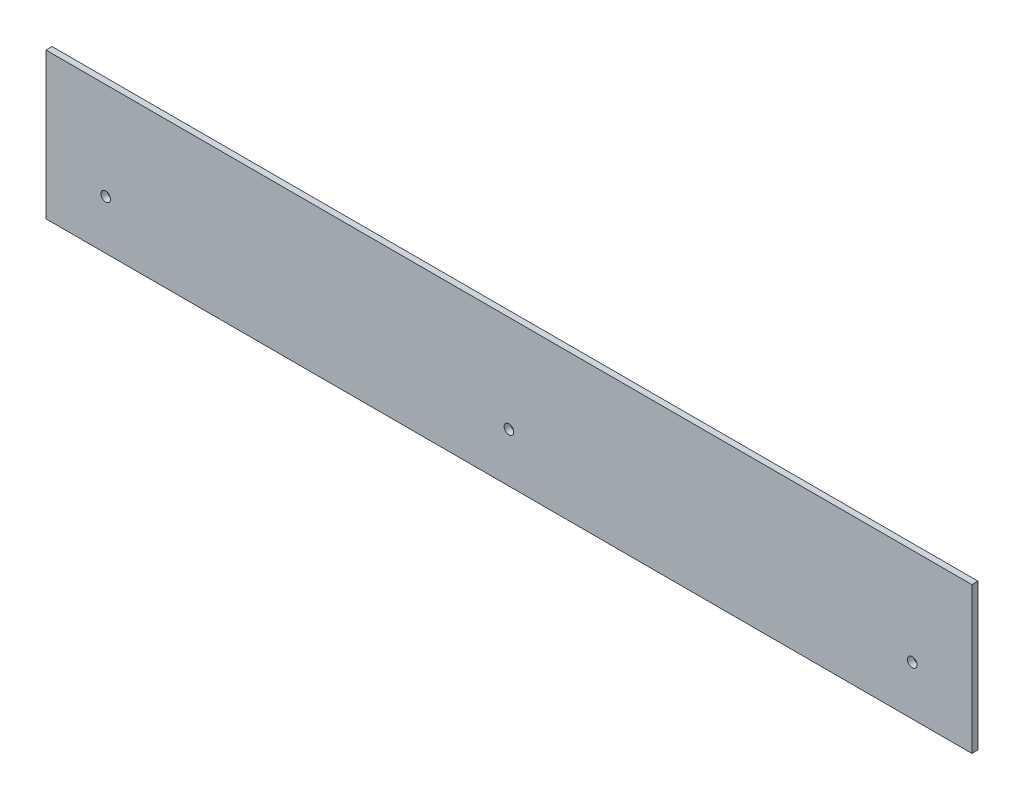
ISO-10303-21;
HEADER;
FILE_DESCRIPTION(('STEP AP214'),'2;1');
FILE_NAME('part.step','',(''),(''),'','','');
FILE_SCHEMA(('AUTOMOTIVE_DESIGN { 1 0 10303 214 1 1 1 1 }'));
ENDSEC;
DATA;
#1=APPLICATION_CONTEXT('core data for automotive mechanical design processes');
#2=APPLICATION_PROTOCOL_DEFINITION('international standard','automotive_design',2000,#1);
#3=PRODUCT_CONTEXT('',#1,'mechanical');
#4=PRODUCT('Part','Part','',(#3));
#5=PRODUCT_RELATED_PRODUCT_CATEGORY('part','',(#4));
#6=PRODUCT_DEFINITION_FORMATION('','',#4);
#7=PRODUCT_DEFINITION_CONTEXT('part definition',#1,'design');
#8=PRODUCT_DEFINITION('design','',#6,#7);
#9=PRODUCT_DEFINITION_SHAPE('','',#8);
#10=(LENGTH_UNIT() NAMED_UNIT(*) SI_UNIT(.MILLI.,.METRE.));
#11=(NAMED_UNIT(*) PLANE_ANGLE_UNIT() SI_UNIT($,.RADIAN.));
#12=(NAMED_UNIT(*) SI_UNIT($,.STERADIAN.) SOLID_ANGLE_UNIT());
#13=UNCERTAINTY_MEASURE_WITH_UNIT(LENGTH_MEASURE(1.E-05),#10,'distance_accuracy_value','');
#14=(GEOMETRIC_REPRESENTATION_CONTEXT(3) GLOBAL_UNCERTAINTY_ASSIGNED_CONTEXT((#13)) GLOBAL_UNIT_ASSIGNED_CONTEXT((#10,
#11,#12)) REPRESENTATION_CONTEXT('',''));
#15=CARTESIAN_POINT('',(0.,0.,0.));
#16=DIRECTION('',(0.,0.,1.));
#17=DIRECTION('',(1.,0.,0.));
#18=AXIS2_PLACEMENT_3D('',#15,#16,#17);
#19=CARTESIAN_POINT('',(0.,0.,3.175));
#20=DIRECTION('',(0.,0.,1.));
#21=DIRECTION('',(1.,0.,0.));
#22=AXIS2_PLACEMENT_3D('',#19,#20,#21);
#23=PLANE('',#22);
#24=CARTESIAN_POINT('',(-210.185,-12.446,3.175));
#25=DIRECTION('',(0.,0.,1.));
#26=DIRECTION('',(1.,0.,0.));
#27=AXIS2_PLACEMENT_3D('',#24,#25,#26);
#28=CIRCLE('',#27,2.5);
#29=CARTESIAN_POINT('',(-207.685,-12.446,3.175));
#30=VERTEX_POINT('',#29);
#31=EDGE_CURVE('E163',#30,#30,#28,.T.);
#32=ORIENTED_EDGE('',*,*,#31,.F.);
#33=EDGE_LOOP('',(#32));
#34=FACE_BOUND('',#33,.T.);
#35=DIRECTION('',(0.,-1.,0.));
#36=VECTOR('',#35,1.);
#37=CARTESIAN_POINT('',(-241.3,38.1,3.175));
#38=LINE('',#37,#36);
#39=CARTESIAN_POINT('',(-241.3,38.1,3.175));
#40=VERTEX_POINT('',#39);
#41=CARTESIAN_POINT('',(-241.3,-38.1,3.175));
#42=VERTEX_POINT('',#41);
#43=EDGE_CURVE('E102',#40,#42,#38,.T.);
#44=ORIENTED_EDGE('',*,*,#43,.T.);
#45=DIRECTION('',(1.,0.,0.));
#46=VECTOR('',#45,1.);
#47=CARTESIAN_POINT('',(-241.3,-38.1,3.175));
#48=LINE('',#47,#46);
#49=CARTESIAN_POINT('',(241.3,-38.1,3.175));
#50=VERTEX_POINT('',#49);
#51=EDGE_CURVE('E94',#42,#50,#48,.T.);
#52=ORIENTED_EDGE('',*,*,#51,.T.);
#53=DIRECTION('',(0.,-1.,0.));
#54=VECTOR('',#53,1.);
#55=CARTESIAN_POINT('',(241.3,38.1,3.175));
#56=LINE('',#55,#54);
#57=CARTESIAN_POINT('',(241.3,38.1,3.175));
#58=VERTEX_POINT('',#57);
#59=EDGE_CURVE('E101',#58,#50,#56,.T.);
#60=ORIENTED_EDGE('',*,*,#59,.F.);
#61=DIRECTION('',(1.,0.,0.));
#62=VECTOR('',#61,1.);
#63=CARTESIAN_POINT('',(-241.3,38.1,3.175));
#64=LINE('',#63,#62);
#65=EDGE_CURVE('E114',#40,#58,#64,.T.);
#66=ORIENTED_EDGE('',*,*,#65,.F.);
#67=EDGE_LOOP('',(#44,#52,#60,#66));
#68=FACE_BOUND('',#67,.T.);
#69=CARTESIAN_POINT('',(0.,-12.446,3.175));
#70=DIRECTION('',(0.,0.,1.));
#71=DIRECTION('',(1.,0.,0.));
#72=AXIS2_PLACEMENT_3D('',#69,#70,#71);
#73=CIRCLE('',#72,2.5);
#74=CARTESIAN_POINT('',(2.5,-12.446,3.175));
#75=VERTEX_POINT('',#74);
#76=EDGE_CURVE('E151',#75,#75,#73,.T.);
#77=ORIENTED_EDGE('',*,*,#76,.F.);
#78=EDGE_LOOP('',(#77));
#79=FACE_BOUND('',#78,.T.);
#80=CARTESIAN_POINT('',(210.185,-12.446,3.175));
#81=DIRECTION('',(0.,0.,-1.));
#82=DIRECTION('',(-1.,0.,0.));
#83=AXIS2_PLACEMENT_3D('',#80,#81,#82);
#84=CIRCLE('',#83,2.5);
#85=CARTESIAN_POINT('',(207.685,-12.446,3.175));
#86=VERTEX_POINT('',#85);
#87=EDGE_CURVE('E159',#86,#86,#84,.T.);
#88=ORIENTED_EDGE('',*,*,#87,.T.);
#89=EDGE_LOOP('',(#88));
#90=FACE_BOUND('',#89,.T.);
#91=ADVANCED_FACE('F51',(#34,#68,#79,#90),#23,.T.);
#92=CARTESIAN_POINT('',(0.,0.,0.));
#93=DIRECTION('',(0.,0.,1.));
#94=DIRECTION('',(1.,0.,0.));
#95=AXIS2_PLACEMENT_3D('',#92,#93,#94);
#96=PLANE('',#95);
#97=CARTESIAN_POINT('',(-210.185,-12.446,0.));
#98=DIRECTION('',(0.,0.,1.));
#99=DIRECTION('',(1.,0.,0.));
#100=AXIS2_PLACEMENT_3D('',#97,#98,#99);
#101=CIRCLE('',#100,2.5);
#102=CARTESIAN_POINT('',(-207.685,-12.446,0.));
#103=VERTEX_POINT('',#102);
#104=EDGE_CURVE('E124',#103,#103,#101,.T.);
#105=ORIENTED_EDGE('',*,*,#104,.T.);
#106=EDGE_LOOP('',(#105));
#107=FACE_BOUND('',#106,.T.);
#108=CARTESIAN_POINT('',(0.,-12.446,0.));
#109=DIRECTION('',(0.,0.,1.));
#110=DIRECTION('',(1.,0.,0.));
#111=AXIS2_PLACEMENT_3D('',#108,#109,#110);
#112=CIRCLE('',#111,2.5);
#113=CARTESIAN_POINT('',(2.5,-12.446,0.));
#114=VERTEX_POINT('',#113);
#115=EDGE_CURVE('E147',#114,#114,#112,.T.);
#116=ORIENTED_EDGE('',*,*,#115,.T.);
#117=EDGE_LOOP('',(#116));
#118=FACE_BOUND('',#117,.T.);
#119=DIRECTION('',(0.,-1.,0.));
#120=VECTOR('',#119,1.);
#121=CARTESIAN_POINT('',(-241.3,38.1,0.));
#122=LINE('',#121,#120);
#123=CARTESIAN_POINT('',(-241.3,38.1,0.));
#124=VERTEX_POINT('',#123);
#125=CARTESIAN_POINT('',(-241.3,-38.1,0.));
#126=VERTEX_POINT('',#125);
#127=EDGE_CURVE('E121',#124,#126,#122,.T.);
#128=ORIENTED_EDGE('',*,*,#127,.F.);
#129=DIRECTION('',(1.,0.,0.));
#130=VECTOR('',#129,1.);
#131=CARTESIAN_POINT('',(-241.3,38.1,0.));
#132=LINE('',#131,#130);
#133=CARTESIAN_POINT('',(241.3,38.1,0.));
#134=VERTEX_POINT('',#133);
#135=EDGE_CURVE('E130',#124,#134,#132,.T.);
#136=ORIENTED_EDGE('',*,*,#135,.T.);
#137=DIRECTION('',(0.,-1.,0.));
#138=VECTOR('',#137,1.);
#139=CARTESIAN_POINT('',(241.3,38.1,0.));
#140=LINE('',#139,#138);
#141=CARTESIAN_POINT('',(241.3,-38.1,0.));
#142=VERTEX_POINT('',#141);
#143=EDGE_CURVE('E127',#134,#142,#140,.T.);
#144=ORIENTED_EDGE('',*,*,#143,.T.);
#145=DIRECTION('',(1.,0.,0.));
#146=VECTOR('',#145,1.);
#147=CARTESIAN_POINT('',(-241.3,-38.1,0.));
#148=LINE('',#147,#146);
#149=EDGE_CURVE('E108',#126,#142,#148,.T.);
#150=ORIENTED_EDGE('',*,*,#149,.F.);
#151=EDGE_LOOP('',(#128,#136,#144,#150));
#152=FACE_BOUND('',#151,.T.);
#153=CARTESIAN_POINT('',(210.185,-12.446,0.));
#154=DIRECTION('',(0.,0.,-1.));
#155=DIRECTION('',(-1.,0.,0.));
#156=AXIS2_PLACEMENT_3D('',#153,#154,#155);
#157=CIRCLE('',#156,2.5);
#158=CARTESIAN_POINT('',(207.685,-12.446,0.));
#159=VERTEX_POINT('',#158);
#160=EDGE_CURVE('E155',#159,#159,#157,.T.);
#161=ORIENTED_EDGE('',*,*,#160,.F.);
#162=EDGE_LOOP('',(#161));
#163=FACE_BOUND('',#162,.T.);
#164=ADVANCED_FACE('F172',(#107,#118,#152,#163),#96,.F.);
#165=CARTESIAN_POINT('',(-241.3,38.1,3.175));
#166=DIRECTION('',(1.,0.,0.));
#167=DIRECTION('',(0.,1.,0.));
#168=AXIS2_PLACEMENT_3D('',#165,#166,#167);
#169=PLANE('',#168);
#170=ORIENTED_EDGE('',*,*,#127,.T.);
#171=DIRECTION('',(0.,0.,-1.));
#172=VECTOR('',#171,1.);
#173=CARTESIAN_POINT('',(-241.3,-38.1,3.175));
#174=LINE('',#173,#172);
#175=EDGE_CURVE('E11',#42,#126,#174,.T.);
#176=ORIENTED_EDGE('',*,*,#175,.F.);
#177=ORIENTED_EDGE('',*,*,#43,.F.);
#178=DIRECTION('',(0.,0.,-1.));
#179=VECTOR('',#178,1.);
#180=CARTESIAN_POINT('',(-241.3,38.1,3.175));
#181=LINE('',#180,#179);
#182=EDGE_CURVE('E69',#40,#124,#181,.T.);
#183=ORIENTED_EDGE('',*,*,#182,.T.);
#184=EDGE_LOOP('',(#170,#176,#177,#183));
#185=FACE_BOUND('',#184,.T.);
#186=ADVANCED_FACE('F53',(#185),#169,.F.);
#187=CARTESIAN_POINT('',(-241.3,-38.1,3.175));
#188=DIRECTION('',(0.,1.,0.));
#189=DIRECTION('',(0.,0.,1.));
#190=AXIS2_PLACEMENT_3D('',#187,#188,#189);
#191=PLANE('',#190);
#192=ORIENTED_EDGE('',*,*,#149,.T.);
#193=DIRECTION('',(0.,0.,-1.));
#194=VECTOR('',#193,1.);
#195=CARTESIAN_POINT('',(241.3,-38.1,3.175));
#196=LINE('',#195,#194);
#197=EDGE_CURVE('E61',#50,#142,#196,.T.);
#198=ORIENTED_EDGE('',*,*,#197,.F.);
#199=ORIENTED_EDGE('',*,*,#51,.F.);
#200=ORIENTED_EDGE('',*,*,#175,.T.);
#201=EDGE_LOOP('',(#192,#198,#199,#200));
#202=FACE_BOUND('',#201,.T.);
#203=ADVANCED_FACE('F107',(#202),#191,.F.);
#204=CARTESIAN_POINT('',(241.3,38.1,3.175));
#205=DIRECTION('',(1.,0.,0.));
#206=DIRECTION('',(0.,0.,-1.));
#207=AXIS2_PLACEMENT_3D('',#204,#205,#206);
#208=PLANE('',#207);
#209=ORIENTED_EDGE('',*,*,#143,.F.);
#210=DIRECTION('',(0.,0.,-1.));
#211=VECTOR('',#210,1.);
#212=CARTESIAN_POINT('',(241.3,38.1,3.175));
#213=LINE('',#212,#211);
#214=EDGE_CURVE('E83',#58,#134,#213,.T.);
#215=ORIENTED_EDGE('',*,*,#214,.F.);
#216=ORIENTED_EDGE('',*,*,#59,.T.);
#217=ORIENTED_EDGE('',*,*,#197,.T.);
#218=EDGE_LOOP('',(#209,#215,#216,#217));
#219=FACE_BOUND('',#218,.T.);
#220=ADVANCED_FACE('F112',(#219),#208,.T.);
#221=CARTESIAN_POINT('',(-241.3,38.1,3.175));
#222=DIRECTION('',(0.,1.,0.));
#223=DIRECTION('',(0.,0.,1.));
#224=AXIS2_PLACEMENT_3D('',#221,#222,#223);
#225=PLANE('',#224);
#226=ORIENTED_EDGE('',*,*,#135,.F.);
#227=ORIENTED_EDGE('',*,*,#182,.F.);
#228=ORIENTED_EDGE('',*,*,#65,.T.);
#229=ORIENTED_EDGE('',*,*,#214,.T.);
#230=EDGE_LOOP('',(#226,#227,#228,#229));
#231=FACE_BOUND('',#230,.T.);
#232=ADVANCED_FACE('F193',(#231),#225,.T.);
#233=CARTESIAN_POINT('',(0.,-12.446,0.));
#234=DIRECTION('',(0.,0.,1.));
#235=DIRECTION('',(1.,0.,0.));
#236=AXIS2_PLACEMENT_3D('',#233,#234,#235);
#237=CYLINDRICAL_SURFACE('',#236,2.5);
#238=ORIENTED_EDGE('',*,*,#115,.F.);
#239=EDGE_LOOP('',(#238));
#240=FACE_BOUND('',#239,.T.);
#241=ORIENTED_EDGE('',*,*,#76,.T.);
#242=EDGE_LOOP('',(#241));
#243=FACE_BOUND('',#242,.T.);
#244=ADVANCED_FACE('F190',(#240,#243),#237,.F.);
#245=CARTESIAN_POINT('',(210.185,-12.446,0.));
#246=DIRECTION('',(0.,0.,1.));
#247=DIRECTION('',(1.,0.,0.));
#248=AXIS2_PLACEMENT_3D('',#245,#246,#247);
#249=CYLINDRICAL_SURFACE('',#248,2.5);
#250=ORIENTED_EDGE('',*,*,#160,.T.);
#251=EDGE_LOOP('',(#250));
#252=FACE_BOUND('',#251,.T.);
#253=ORIENTED_EDGE('',*,*,#87,.F.);
#254=EDGE_LOOP('',(#253));
#255=FACE_BOUND('',#254,.T.);
#256=ADVANCED_FACE('F178',(#252,#255),#249,.F.);
#257=CARTESIAN_POINT('',(-210.185,-12.446,0.));
#258=DIRECTION('',(0.,0.,1.));
#259=DIRECTION('',(1.,0.,0.));
#260=AXIS2_PLACEMENT_3D('',#257,#258,#259);
#261=CYLINDRICAL_SURFACE('',#260,2.5);
#262=ORIENTED_EDGE('',*,*,#104,.F.);
#263=EDGE_LOOP('',(#262));
#264=FACE_BOUND('',#263,.T.);
#265=ORIENTED_EDGE('',*,*,#31,.T.);
#266=EDGE_LOOP('',(#265));
#267=FACE_BOUND('',#266,.T.);
#268=ADVANCED_FACE('F175',(#264,#267),#261,.F.);
#269=CLOSED_SHELL('',(#91,#164,#186,#203,#220,#232,#244,#256,#268));
#270=MANIFOLD_SOLID_BREP('B2',#269);
#271=ADVANCED_BREP_SHAPE_REPRESENTATION('',(#18,#270),#14);
#272=SHAPE_DEFINITION_REPRESENTATION(#9,#271);
ENDSEC;
END-ISO-10303-21;
